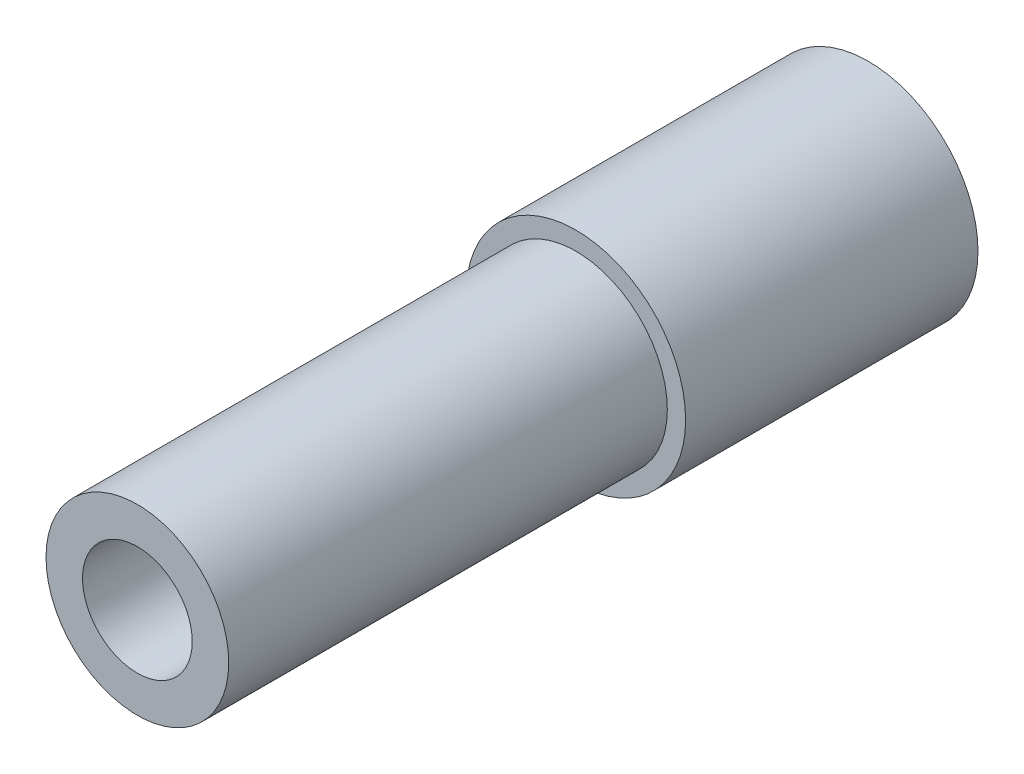
ISO-10303-21;
HEADER;
FILE_DESCRIPTION(('STEP AP214'),'2;1');
FILE_NAME('part.step','',(''),(''),'','','');
FILE_SCHEMA(('AUTOMOTIVE_DESIGN { 1 0 10303 214 1 1 1 1 }'));
ENDSEC;
DATA;
#1=APPLICATION_CONTEXT('core data for automotive mechanical design processes');
#2=APPLICATION_PROTOCOL_DEFINITION('international standard','automotive_design',2000,#1);
#3=PRODUCT_CONTEXT('',#1,'mechanical');
#4=PRODUCT('Part','Part','',(#3));
#5=PRODUCT_RELATED_PRODUCT_CATEGORY('part','',(#4));
#6=PRODUCT_DEFINITION_FORMATION('','',#4);
#7=PRODUCT_DEFINITION_CONTEXT('part definition',#1,'design');
#8=PRODUCT_DEFINITION('design','',#6,#7);
#9=PRODUCT_DEFINITION_SHAPE('','',#8);
#10=(LENGTH_UNIT() NAMED_UNIT(*) SI_UNIT(.MILLI.,.METRE.));
#11=(NAMED_UNIT(*) PLANE_ANGLE_UNIT() SI_UNIT($,.RADIAN.));
#12=(NAMED_UNIT(*) SI_UNIT($,.STERADIAN.) SOLID_ANGLE_UNIT());
#13=UNCERTAINTY_MEASURE_WITH_UNIT(LENGTH_MEASURE(1.E-05),#10,'distance_accuracy_value','');
#14=(GEOMETRIC_REPRESENTATION_CONTEXT(3) GLOBAL_UNCERTAINTY_ASSIGNED_CONTEXT((#13)) GLOBAL_UNIT_ASSIGNED_CONTEXT((#10,
#11,#12)) REPRESENTATION_CONTEXT('',''));
#15=CARTESIAN_POINT('',(0.,0.,0.));
#16=DIRECTION('',(0.,0.,1.));
#17=DIRECTION('',(1.,0.,0.));
#18=AXIS2_PLACEMENT_3D('',#15,#16,#17);
#19=CARTESIAN_POINT('',(0.,0.,40.));
#20=DIRECTION('',(0.,0.,1.));
#21=DIRECTION('',(1.,0.,0.));
#22=AXIS2_PLACEMENT_3D('',#19,#20,#21);
#23=PLANE('',#22);
#24=CARTESIAN_POINT('',(0.,0.,40.));
#25=DIRECTION('',(0.,0.,1.));
#26=DIRECTION('',(1.,0.,0.));
#27=AXIS2_PLACEMENT_3D('',#24,#25,#26);
#28=CIRCLE('',#27,12.5);
#29=CARTESIAN_POINT('',(12.5,0.,40.));
#30=VERTEX_POINT('',#29);
#31=EDGE_CURVE('E52',#30,#30,#28,.T.);
#32=ORIENTED_EDGE('',*,*,#31,.F.);
#33=EDGE_LOOP('',(#32));
#34=FACE_BOUND('',#33,.T.);
#35=CARTESIAN_POINT('',(0.,0.,40.));
#36=DIRECTION('',(0.,0.,1.));
#37=DIRECTION('',(1.,0.,0.));
#38=AXIS2_PLACEMENT_3D('',#35,#36,#37);
#39=CIRCLE('',#38,15.);
#40=CARTESIAN_POINT('',(15.,0.,40.));
#41=VERTEX_POINT('',#40);
#42=EDGE_CURVE('E10',#41,#41,#39,.T.);
#43=ORIENTED_EDGE('',*,*,#42,.T.);
#44=EDGE_LOOP('',(#43));
#45=FACE_BOUND('',#44,.T.);
#46=ADVANCED_FACE('F33',(#34,#45),#23,.T.);
#47=CARTESIAN_POINT('',(0.,0.,0.));
#48=DIRECTION('',(0.,0.,1.));
#49=DIRECTION('',(1.,0.,0.));
#50=AXIS2_PLACEMENT_3D('',#47,#48,#49);
#51=PLANE('',#50);
#52=CARTESIAN_POINT('',(0.,0.,0.));
#53=DIRECTION('',(0.,0.,1.));
#54=DIRECTION('',(1.,0.,0.));
#55=AXIS2_PLACEMENT_3D('',#52,#53,#54);
#56=CIRCLE('',#55,15.);
#57=CARTESIAN_POINT('',(15.,0.,0.));
#58=VERTEX_POINT('',#57);
#59=EDGE_CURVE('E37',#58,#58,#56,.T.);
#60=ORIENTED_EDGE('',*,*,#59,.F.);
#61=EDGE_LOOP('',(#60));
#62=FACE_BOUND('',#61,.T.);
#63=CARTESIAN_POINT('',(0.,0.,0.));
#64=DIRECTION('',(0.,0.,1.));
#65=DIRECTION('',(1.,0.,0.));
#66=AXIS2_PLACEMENT_3D('',#63,#64,#65);
#67=CIRCLE('',#66,11.);
#68=CARTESIAN_POINT('',(11.,0.,0.));
#69=VERTEX_POINT('',#68);
#70=EDGE_CURVE('E44',#69,#69,#67,.T.);
#71=ORIENTED_EDGE('',*,*,#70,.T.);
#72=EDGE_LOOP('',(#71));
#73=FACE_BOUND('',#72,.T.);
#74=ADVANCED_FACE('F84',(#62,#73),#51,.F.);
#75=CARTESIAN_POINT('',(0.,0.,40.));
#76=DIRECTION('',(0.,0.,-1.));
#77=DIRECTION('',(-1.,0.,0.));
#78=AXIS2_PLACEMENT_3D('',#75,#76,#77);
#79=CYLINDRICAL_SURFACE('',#78,15.);
#80=ORIENTED_EDGE('',*,*,#42,.F.);
#81=EDGE_LOOP('',(#80));
#82=FACE_BOUND('',#81,.T.);
#83=ORIENTED_EDGE('',*,*,#59,.T.);
#84=EDGE_LOOP('',(#83));
#85=FACE_BOUND('',#84,.T.);
#86=ADVANCED_FACE('F35',(#82,#85),#79,.T.);
#87=CARTESIAN_POINT('',(0.,0.,40.));
#88=DIRECTION('',(0.,0.,-1.));
#89=DIRECTION('',(-1.,0.,0.));
#90=AXIS2_PLACEMENT_3D('',#87,#88,#89);
#91=CYLINDRICAL_SURFACE('',#90,11.);
#92=CARTESIAN_POINT('',(0.,0.,40.));
#93=DIRECTION('',(0.,0.,1.));
#94=DIRECTION('',(1.,0.,0.));
#95=AXIS2_PLACEMENT_3D('',#92,#93,#94);
#96=CIRCLE('',#95,11.);
#97=CARTESIAN_POINT('',(11.,0.,40.));
#98=VERTEX_POINT('',#97);
#99=EDGE_CURVE('E48',#98,#98,#96,.T.);
#100=ORIENTED_EDGE('',*,*,#99,.T.);
#101=EDGE_LOOP('',(#100));
#102=FACE_BOUND('',#101,.T.);
#103=ORIENTED_EDGE('',*,*,#70,.F.);
#104=EDGE_LOOP('',(#103));
#105=FACE_BOUND('',#104,.T.);
#106=ADVANCED_FACE('F79',(#102,#105),#91,.F.);
#107=CARTESIAN_POINT('',(0.,0.,40.));
#108=DIRECTION('',(0.,0.,1.));
#109=DIRECTION('',(1.,0.,0.));
#110=AXIS2_PLACEMENT_3D('',#107,#108,#109);
#111=PLANE('',#110);
#112=CARTESIAN_POINT('',(0.,0.,40.));
#113=DIRECTION('',(0.,0.,1.));
#114=DIRECTION('',(1.,0.,0.));
#115=AXIS2_PLACEMENT_3D('',#112,#113,#114);
#116=CIRCLE('',#115,7.5);
#117=CARTESIAN_POINT('',(7.5,0.,40.));
#118=VERTEX_POINT('',#117);
#119=EDGE_CURVE('E58',#118,#118,#116,.T.);
#120=ORIENTED_EDGE('',*,*,#119,.T.);
#121=EDGE_LOOP('',(#120));
#122=FACE_BOUND('',#121,.T.);
#123=ORIENTED_EDGE('',*,*,#99,.F.);
#124=EDGE_LOOP('',(#123));
#125=FACE_BOUND('',#124,.T.);
#126=ADVANCED_FACE('F70',(#122,#125),#111,.F.);
#127=CARTESIAN_POINT('',(0.,0.,100.));
#128=DIRECTION('',(0.,0.,1.));
#129=DIRECTION('',(1.,0.,0.));
#130=AXIS2_PLACEMENT_3D('',#127,#128,#129);
#131=PLANE('',#130);
#132=CARTESIAN_POINT('',(0.,0.,100.));
#133=DIRECTION('',(0.,0.,1.));
#134=DIRECTION('',(1.,0.,0.));
#135=AXIS2_PLACEMENT_3D('',#132,#133,#134);
#136=CIRCLE('',#135,12.5);
#137=CARTESIAN_POINT('',(12.5,0.,100.));
#138=VERTEX_POINT('',#137);
#139=EDGE_CURVE('E51',#138,#138,#136,.T.);
#140=ORIENTED_EDGE('',*,*,#139,.T.);
#141=EDGE_LOOP('',(#140));
#142=FACE_BOUND('',#141,.T.);
#143=CARTESIAN_POINT('',(0.,0.,100.));
#144=DIRECTION('',(0.,0.,1.));
#145=DIRECTION('',(1.,0.,0.));
#146=AXIS2_PLACEMENT_3D('',#143,#144,#145);
#147=CIRCLE('',#146,7.5);
#148=CARTESIAN_POINT('',(7.5,0.,100.));
#149=VERTEX_POINT('',#148);
#150=EDGE_CURVE('E55',#149,#149,#147,.T.);
#151=ORIENTED_EDGE('',*,*,#150,.F.);
#152=EDGE_LOOP('',(#151));
#153=FACE_BOUND('',#152,.T.);
#154=ADVANCED_FACE('F67',(#142,#153),#131,.T.);
#155=CARTESIAN_POINT('',(0.,0.,100.));
#156=DIRECTION('',(0.,0.,-1.));
#157=DIRECTION('',(-1.,0.,0.));
#158=AXIS2_PLACEMENT_3D('',#155,#156,#157);
#159=CYLINDRICAL_SURFACE('',#158,12.5);
#160=ORIENTED_EDGE('',*,*,#139,.F.);
#161=EDGE_LOOP('',(#160));
#162=FACE_BOUND('',#161,.T.);
#163=ORIENTED_EDGE('',*,*,#31,.T.);
#164=EDGE_LOOP('',(#163));
#165=FACE_BOUND('',#164,.T.);
#166=ADVANCED_FACE('F69',(#162,#165),#159,.T.);
#167=CARTESIAN_POINT('',(0.,0.,100.));
#168=DIRECTION('',(0.,0.,-1.));
#169=DIRECTION('',(-1.,0.,0.));
#170=AXIS2_PLACEMENT_3D('',#167,#168,#169);
#171=CYLINDRICAL_SURFACE('',#170,7.5);
#172=ORIENTED_EDGE('',*,*,#150,.T.);
#173=EDGE_LOOP('',(#172));
#174=FACE_BOUND('',#173,.T.);
#175=ORIENTED_EDGE('',*,*,#119,.F.);
#176=EDGE_LOOP('',(#175));
#177=FACE_BOUND('',#176,.T.);
#178=ADVANCED_FACE('F64',(#174,#177),#171,.F.);
#179=CLOSED_SHELL('',(#46,#74,#86,#106,#126,#154,#166,#178));
#180=MANIFOLD_SOLID_BREP('B2',#179);
#181=ADVANCED_BREP_SHAPE_REPRESENTATION('',(#18,#180),#14);
#182=SHAPE_DEFINITION_REPRESENTATION(#9,#181);
ENDSEC;
END-ISO-10303-21;
